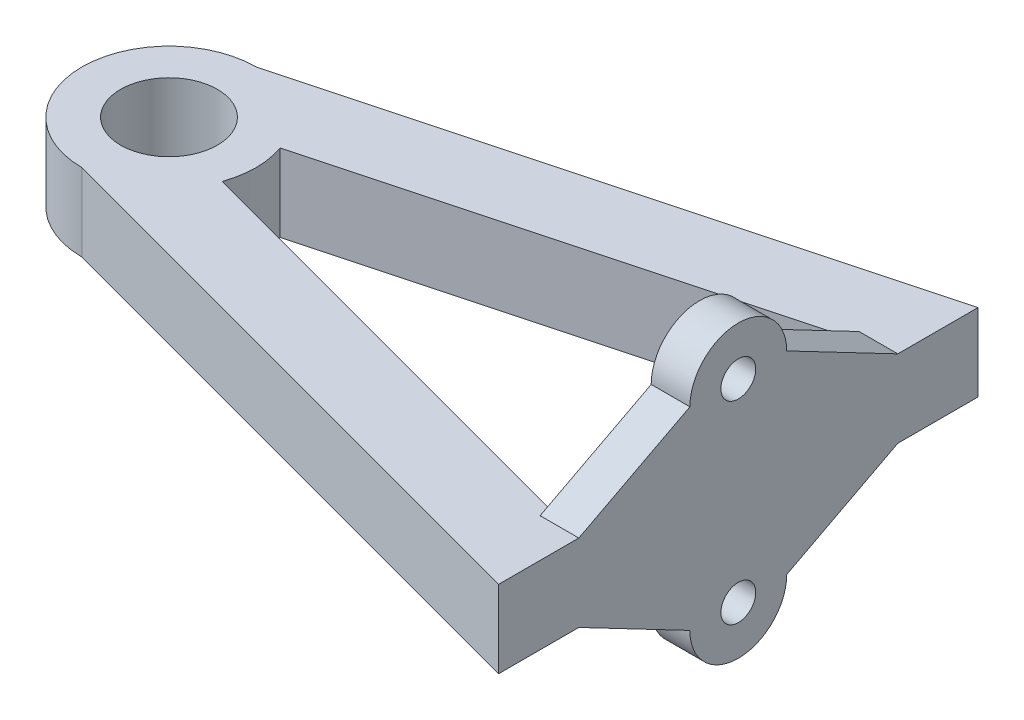
ISO-10303-21;
HEADER;
FILE_DESCRIPTION(('STEP AP214'),'2;1');
FILE_NAME('part.step','',(''),(''),'','','');
FILE_SCHEMA(('AUTOMOTIVE_DESIGN { 1 0 10303 214 1 1 1 1 }'));
ENDSEC;
DATA;
#1=APPLICATION_CONTEXT('core data for automotive mechanical design processes');
#2=APPLICATION_PROTOCOL_DEFINITION('international standard','automotive_design',2000,#1);
#3=PRODUCT_CONTEXT('',#1,'mechanical');
#4=PRODUCT('Part','Part','',(#3));
#5=PRODUCT_RELATED_PRODUCT_CATEGORY('part','',(#4));
#6=PRODUCT_DEFINITION_FORMATION('','',#4);
#7=PRODUCT_DEFINITION_CONTEXT('part definition',#1,'design');
#8=PRODUCT_DEFINITION('design','',#6,#7);
#9=PRODUCT_DEFINITION_SHAPE('','',#8);
#10=(LENGTH_UNIT() NAMED_UNIT(*) SI_UNIT(.MILLI.,.METRE.));
#11=(NAMED_UNIT(*) PLANE_ANGLE_UNIT() SI_UNIT($,.RADIAN.));
#12=(NAMED_UNIT(*) SI_UNIT($,.STERADIAN.) SOLID_ANGLE_UNIT());
#13=UNCERTAINTY_MEASURE_WITH_UNIT(LENGTH_MEASURE(1.E-05),#10,'distance_accuracy_value','');
#14=(GEOMETRIC_REPRESENTATION_CONTEXT(3) GLOBAL_UNCERTAINTY_ASSIGNED_CONTEXT((#13)) GLOBAL_UNIT_ASSIGNED_CONTEXT((#10,
#11,#12)) REPRESENTATION_CONTEXT('',''));
#15=CARTESIAN_POINT('',(0.,0.,0.));
#16=DIRECTION('',(0.,0.,1.));
#17=DIRECTION('',(1.,0.,0.));
#18=AXIS2_PLACEMENT_3D('',#15,#16,#17);
#19=CARTESIAN_POINT('',(73.5,10.,20.5915038395862));
#20=DIRECTION('',(-0.258819045102515,0.,0.96592582628907));
#21=DIRECTION('',(0.96592582628907,0.,0.258819045102515));
#22=AXIS2_PLACEMENT_3D('',#19,#20,#21);
#23=PLANE('',#22);
#24=DIRECTION('',(0.,1.,0.));
#25=VECTOR('',#24,1.);
#26=CARTESIAN_POINT('',(68.5,10.,19.2517578774306));
#27=LINE('',#26,#25);
#28=CARTESIAN_POINT('',(68.5,0.,19.2517578774306));
#29=VERTEX_POINT('',#28);
#30=CARTESIAN_POINT('',(68.5,10.,19.2517578774306));
#31=VERTEX_POINT('',#30);
#32=EDGE_CURVE('E218',#29,#31,#27,.T.);
#33=ORIENTED_EDGE('',*,*,#32,.F.);
#34=DIRECTION('',(-0.96592582628907,0.,-0.258819045102515));
#35=VECTOR('',#34,1.);
#36=CARTESIAN_POINT('',(73.5,0.,20.5915038395862));
#37=LINE('',#36,#35);
#38=CARTESIAN_POINT('',(10.6100628688813,0.,3.74019597325932));
#39=VERTEX_POINT('',#38);
#40=EDGE_CURVE('E255',#29,#39,#37,.T.);
#41=ORIENTED_EDGE('',*,*,#40,.T.);
#42=DIRECTION('',(0.,-1.,0.));
#43=VECTOR('',#42,1.);
#44=CARTESIAN_POINT('',(10.6100628688813,10.,3.74019597325932));
#45=LINE('',#44,#43);
#46=CARTESIAN_POINT('',(10.6100628688813,10.,3.74019597325932));
#47=VERTEX_POINT('',#46);
#48=EDGE_CURVE('E273',#47,#39,#45,.T.);
#49=ORIENTED_EDGE('',*,*,#48,.F.);
#50=DIRECTION('',(-0.96592582628907,0.,-0.258819045102515));
#51=VECTOR('',#50,1.);
#52=CARTESIAN_POINT('',(73.5,10.,20.5915038395862));
#53=LINE('',#52,#51);
#54=EDGE_CURVE('E237',#31,#47,#53,.T.);
#55=ORIENTED_EDGE('',*,*,#54,.F.);
#56=EDGE_LOOP('',(#33,#41,#49,#55));
#57=FACE_BOUND('',#56,.T.);
#58=ADVANCED_FACE('F33',(#57),#23,.F.);
#59=CARTESIAN_POINT('',(73.5,10.,-20.5915038395862));
#60=DIRECTION('',(-0.258819045102515,0.,-0.96592582628907));
#61=DIRECTION('',(-0.96592582628907,0.,0.258819045102515));
#62=AXIS2_PLACEMENT_3D('',#59,#60,#61);
#63=PLANE('',#62);
#64=DIRECTION('',(0.,-1.,0.));
#65=VECTOR('',#64,1.);
#66=CARTESIAN_POINT('',(68.5,10.,-19.2517578774306));
#67=LINE('',#66,#65);
#68=CARTESIAN_POINT('',(68.5,10.,-19.2517578774306));
#69=VERTEX_POINT('',#68);
#70=CARTESIAN_POINT('',(68.5,0.,-19.2517578774306));
#71=VERTEX_POINT('',#70);
#72=EDGE_CURVE('E11',#69,#71,#67,.T.);
#73=ORIENTED_EDGE('',*,*,#72,.F.);
#74=DIRECTION('',(0.96592582628907,0.,-0.258819045102515));
#75=VECTOR('',#74,1.);
#76=CARTESIAN_POINT('',(73.5,10.,-20.5915038395862));
#77=LINE('',#76,#75);
#78=CARTESIAN_POINT('',(10.6100628688813,10.,-3.74019597325932));
#79=VERTEX_POINT('',#78);
#80=EDGE_CURVE('E241',#79,#69,#77,.T.);
#81=ORIENTED_EDGE('',*,*,#80,.F.);
#82=DIRECTION('',(0.,-1.,0.));
#83=VECTOR('',#82,1.);
#84=CARTESIAN_POINT('',(10.6100628688813,10.,-3.74019597325932));
#85=LINE('',#84,#83);
#86=CARTESIAN_POINT('',(10.6100628688813,0.,-3.74019597325932));
#87=VERTEX_POINT('',#86);
#88=EDGE_CURVE('E270',#79,#87,#85,.T.);
#89=ORIENTED_EDGE('',*,*,#88,.T.);
#90=DIRECTION('',(0.96592582628907,0.,-0.258819045102515));
#91=VECTOR('',#90,1.);
#92=CARTESIAN_POINT('',(73.5,0.,-20.5915038395862));
#93=LINE('',#92,#91);
#94=EDGE_CURVE('E259',#87,#71,#93,.T.);
#95=ORIENTED_EDGE('',*,*,#94,.T.);
#96=EDGE_LOOP('',(#73,#81,#89,#95));
#97=FACE_BOUND('',#96,.T.);
#98=ADVANCED_FACE('F315',(#97),#63,.F.);
#99=CARTESIAN_POINT('',(0.,10.,0.));
#100=DIRECTION('',(0.,1.,0.));
#101=DIRECTION('',(0.,0.,1.));
#102=AXIS2_PLACEMENT_3D('',#99,#100,#101);
#103=PLANE('',#102);
#104=DIRECTION('',(1.,0.,0.));
#105=VECTOR('',#104,1.);
#106=CARTESIAN_POINT('',(68.5,10.,20.5915038395862));
#107=LINE('',#106,#105);
#108=CARTESIAN_POINT('',(68.5,10.,20.5915038395862));
#109=VERTEX_POINT('',#108);
#110=CARTESIAN_POINT('',(73.5,10.,20.5915038395862));
#111=VERTEX_POINT('',#110);
#112=EDGE_CURVE('E48',#109,#111,#107,.T.);
#113=ORIENTED_EDGE('',*,*,#112,.F.);
#114=DIRECTION('',(0.,0.,-1.));
#115=VECTOR('',#114,1.);
#116=CARTESIAN_POINT('',(68.5,10.,0.));
#117=LINE('',#116,#115);
#118=EDGE_CURVE('E219',#109,#31,#117,.T.);
#119=ORIENTED_EDGE('',*,*,#118,.T.);
#120=ORIENTED_EDGE('',*,*,#54,.T.);
#121=CARTESIAN_POINT('',(0.,10.,0.));
#122=DIRECTION('',(0.,1.,0.));
#123=DIRECTION('',(0.,0.,1.));
#124=AXIS2_PLACEMENT_3D('',#121,#122,#123);
#125=CIRCLE('',#124,11.25);
#126=EDGE_CURVE('E239',#47,#79,#125,.T.);
#127=ORIENTED_EDGE('',*,*,#126,.T.);
#128=ORIENTED_EDGE('',*,*,#80,.T.);
#129=CARTESIAN_POINT('',(68.5,10.,-20.5915038395862));
#130=VERTEX_POINT('',#129);
#131=EDGE_CURVE('E215',#69,#130,#117,.T.);
#132=ORIENTED_EDGE('',*,*,#131,.T.);
#133=DIRECTION('',(1.,0.,0.));
#134=VECTOR('',#133,1.);
#135=CARTESIAN_POINT('',(68.5,10.,-20.5915038395862));
#136=LINE('',#135,#134);
#137=CARTESIAN_POINT('',(73.5,10.,-20.5915038395862));
#138=VERTEX_POINT('',#137);
#139=EDGE_CURVE('E206',#130,#138,#136,.T.);
#140=ORIENTED_EDGE('',*,*,#139,.T.);
#141=DIRECTION('',(0.,0.,-1.));
#142=VECTOR('',#141,1.);
#143=CARTESIAN_POINT('',(73.5,10.,-30.944265643687));
#144=LINE('',#143,#142);
#145=CARTESIAN_POINT('',(73.5,10.,-30.944265643687));
#146=VERTEX_POINT('',#145);
#147=EDGE_CURVE('E244',#138,#146,#144,.T.);
#148=ORIENTED_EDGE('',*,*,#147,.T.);
#149=DIRECTION('',(-0.96592582628907,0.,0.258819045102515));
#150=VECTOR('',#149,1.);
#151=CARTESIAN_POINT('',(0.,10.,-11.25));
#152=LINE('',#151,#150);
#153=CARTESIAN_POINT('',(0.,10.,-11.25));
#154=VERTEX_POINT('',#153);
#155=EDGE_CURVE('E246',#146,#154,#152,.T.);
#156=ORIENTED_EDGE('',*,*,#155,.T.);
#157=CARTESIAN_POINT('',(0.,10.,0.));
#158=DIRECTION('',(0.,1.,0.));
#159=DIRECTION('',(0.,0.,1.));
#160=AXIS2_PLACEMENT_3D('',#157,#158,#159);
#161=CIRCLE('',#160,11.25);
#162=CARTESIAN_POINT('',(0.,10.,11.25));
#163=VERTEX_POINT('',#162);
#164=EDGE_CURVE('E229',#154,#163,#161,.T.);
#165=ORIENTED_EDGE('',*,*,#164,.T.);
#166=DIRECTION('',(0.96592582628907,0.,0.258819045102515));
#167=VECTOR('',#166,1.);
#168=CARTESIAN_POINT('',(0.,10.,11.25));
#169=LINE('',#168,#167);
#170=CARTESIAN_POINT('',(73.5,10.,30.944265643687));
#171=VERTEX_POINT('',#170);
#172=EDGE_CURVE('E232',#163,#171,#169,.T.);
#173=ORIENTED_EDGE('',*,*,#172,.T.);
#174=DIRECTION('',(0.,0.,-1.));
#175=VECTOR('',#174,1.);
#176=CARTESIAN_POINT('',(73.5,10.,30.944265643687));
#177=LINE('',#176,#175);
#178=EDGE_CURVE('E235',#171,#111,#177,.T.);
#179=ORIENTED_EDGE('',*,*,#178,.T.);
#180=EDGE_LOOP('',(#113,#119,#120,#127,#128,#132,#140,#148,#156,#165,#173,#179));
#181=FACE_BOUND('',#180,.T.);
#182=CARTESIAN_POINT('',(0.,10.,0.));
#183=DIRECTION('',(0.,1.,0.));
#184=DIRECTION('',(0.,0.,1.));
#185=AXIS2_PLACEMENT_3D('',#182,#183,#184);
#186=CIRCLE('',#185,6.25);
#187=CARTESIAN_POINT('',(0.,10.,6.25));
#188=VERTEX_POINT('',#187);
#189=EDGE_CURVE('E222',#188,#188,#186,.T.);
#190=ORIENTED_EDGE('',*,*,#189,.F.);
#191=EDGE_LOOP('',(#190));
#192=FACE_BOUND('',#191,.T.);
#193=ADVANCED_FACE('F297',(#181,#192),#103,.T.);
#194=CARTESIAN_POINT('',(0.,0.,0.));
#195=DIRECTION('',(0.,1.,0.));
#196=DIRECTION('',(0.,0.,1.));
#197=AXIS2_PLACEMENT_3D('',#194,#195,#196);
#198=PLANE('',#197);
#199=DIRECTION('',(0.,0.,-1.));
#200=VECTOR('',#199,1.);
#201=CARTESIAN_POINT('',(68.5,0.,0.));
#202=LINE('',#201,#200);
#203=CARTESIAN_POINT('',(68.5,0.,20.5915038395862));
#204=VERTEX_POINT('',#203);
#205=EDGE_CURVE('E56',#204,#29,#202,.T.);
#206=ORIENTED_EDGE('',*,*,#205,.F.);
#207=DIRECTION('',(1.,0.,0.));
#208=VECTOR('',#207,1.);
#209=CARTESIAN_POINT('',(68.5,0.,20.5915038395862));
#210=LINE('',#209,#208);
#211=CARTESIAN_POINT('',(73.5,0.,20.5915038395862));
#212=VERTEX_POINT('',#211);
#213=EDGE_CURVE('E158',#204,#212,#210,.T.);
#214=ORIENTED_EDGE('',*,*,#213,.T.);
#215=DIRECTION('',(0.,0.,-1.));
#216=VECTOR('',#215,1.);
#217=CARTESIAN_POINT('',(73.5,0.,30.944265643687));
#218=LINE('',#217,#216);
#219=CARTESIAN_POINT('',(73.5,0.,30.944265643687));
#220=VERTEX_POINT('',#219);
#221=EDGE_CURVE('E253',#220,#212,#218,.T.);
#222=ORIENTED_EDGE('',*,*,#221,.F.);
#223=DIRECTION('',(0.96592582628907,0.,0.258819045102515));
#224=VECTOR('',#223,1.);
#225=CARTESIAN_POINT('',(0.,0.,11.25));
#226=LINE('',#225,#224);
#227=CARTESIAN_POINT('',(0.,0.,11.25));
#228=VERTEX_POINT('',#227);
#229=EDGE_CURVE('E251',#228,#220,#226,.T.);
#230=ORIENTED_EDGE('',*,*,#229,.F.);
#231=CARTESIAN_POINT('',(0.,0.,0.));
#232=DIRECTION('',(0.,1.,0.));
#233=DIRECTION('',(0.,0.,1.));
#234=AXIS2_PLACEMENT_3D('',#231,#232,#233);
#235=CIRCLE('',#234,11.25);
#236=CARTESIAN_POINT('',(0.,0.,-11.25));
#237=VERTEX_POINT('',#236);
#238=EDGE_CURVE('E225',#237,#228,#235,.T.);
#239=ORIENTED_EDGE('',*,*,#238,.F.);
#240=DIRECTION('',(-0.96592582628907,0.,0.258819045102515));
#241=VECTOR('',#240,1.);
#242=CARTESIAN_POINT('',(0.,0.,-11.25));
#243=LINE('',#242,#241);
#244=CARTESIAN_POINT('',(73.5,0.,-30.944265643687));
#245=VERTEX_POINT('',#244);
#246=EDGE_CURVE('E233',#245,#237,#243,.T.);
#247=ORIENTED_EDGE('',*,*,#246,.F.);
#248=DIRECTION('',(0.,0.,-1.));
#249=VECTOR('',#248,1.);
#250=CARTESIAN_POINT('',(73.5,0.,-30.944265643687));
#251=LINE('',#250,#249);
#252=CARTESIAN_POINT('',(73.5,0.,-20.5915038395862));
#253=VERTEX_POINT('',#252);
#254=EDGE_CURVE('E262',#253,#245,#251,.T.);
#255=ORIENTED_EDGE('',*,*,#254,.F.);
#256=DIRECTION('',(1.,0.,0.));
#257=VECTOR('',#256,1.);
#258=CARTESIAN_POINT('',(68.5,0.,-20.5915038395862));
#259=LINE('',#258,#257);
#260=CARTESIAN_POINT('',(68.5,0.,-20.5915038395862));
#261=VERTEX_POINT('',#260);
#262=EDGE_CURVE('E209',#261,#253,#259,.T.);
#263=ORIENTED_EDGE('',*,*,#262,.F.);
#264=EDGE_CURVE('E201',#71,#261,#202,.T.);
#265=ORIENTED_EDGE('',*,*,#264,.F.);
#266=ORIENTED_EDGE('',*,*,#94,.F.);
#267=CARTESIAN_POINT('',(0.,0.,0.));
#268=DIRECTION('',(0.,1.,0.));
#269=DIRECTION('',(0.,0.,1.));
#270=AXIS2_PLACEMENT_3D('',#267,#268,#269);
#271=CIRCLE('',#270,11.25);
#272=EDGE_CURVE('E257',#39,#87,#271,.T.);
#273=ORIENTED_EDGE('',*,*,#272,.F.);
#274=ORIENTED_EDGE('',*,*,#40,.F.);
#275=EDGE_LOOP('',(#206,#214,#222,#230,#239,#247,#255,#263,#265,#266,#273,#274));
#276=FACE_BOUND('',#275,.T.);
#277=CARTESIAN_POINT('',(0.,0.,0.));
#278=DIRECTION('',(0.,1.,0.));
#279=DIRECTION('',(0.,0.,1.));
#280=AXIS2_PLACEMENT_3D('',#277,#278,#279);
#281=CIRCLE('',#280,6.25);
#282=CARTESIAN_POINT('',(0.,0.,6.25));
#283=VERTEX_POINT('',#282);
#284=EDGE_CURVE('E226',#283,#283,#281,.T.);
#285=ORIENTED_EDGE('',*,*,#284,.T.);
#286=EDGE_LOOP('',(#285));
#287=FACE_BOUND('',#286,.T.);
#288=ADVANCED_FACE('F288',(#276,#287),#198,.F.);
#289=CARTESIAN_POINT('',(0.,10.,0.));
#290=DIRECTION('',(0.,-1.,0.));
#291=DIRECTION('',(0.,0.,-1.));
#292=AXIS2_PLACEMENT_3D('',#289,#290,#291);
#293=CYLINDRICAL_SURFACE('',#292,11.25);
#294=ORIENTED_EDGE('',*,*,#238,.T.);
#295=DIRECTION('',(0.,-1.,0.));
#296=VECTOR('',#295,1.);
#297=CARTESIAN_POINT('',(0.,10.,11.25));
#298=LINE('',#297,#296);
#299=EDGE_CURVE('E41',#163,#228,#298,.T.);
#300=ORIENTED_EDGE('',*,*,#299,.F.);
#301=ORIENTED_EDGE('',*,*,#164,.F.);
#302=DIRECTION('',(0.,-1.,0.));
#303=VECTOR('',#302,1.);
#304=CARTESIAN_POINT('',(0.,10.,-11.25));
#305=LINE('',#304,#303);
#306=EDGE_CURVE('E248',#154,#237,#305,.T.);
#307=ORIENTED_EDGE('',*,*,#306,.T.);
#308=EDGE_LOOP('',(#294,#300,#301,#307));
#309=FACE_BOUND('',#308,.T.);
#310=ADVANCED_FACE('F35',(#309),#293,.T.);
#311=CARTESIAN_POINT('',(0.,10.,11.25));
#312=DIRECTION('',(0.258819045102515,0.,-0.96592582628907));
#313=DIRECTION('',(-0.96592582628907,0.,-0.258819045102515));
#314=AXIS2_PLACEMENT_3D('',#311,#312,#313);
#315=PLANE('',#314);
#316=ORIENTED_EDGE('',*,*,#229,.T.);
#317=DIRECTION('',(0.,-1.,0.));
#318=VECTOR('',#317,1.);
#319=CARTESIAN_POINT('',(73.5,10.,30.944265643687));
#320=LINE('',#319,#318);
#321=EDGE_CURVE('E276',#171,#220,#320,.T.);
#322=ORIENTED_EDGE('',*,*,#321,.F.);
#323=ORIENTED_EDGE('',*,*,#172,.F.);
#324=ORIENTED_EDGE('',*,*,#299,.T.);
#325=EDGE_LOOP('',(#316,#322,#323,#324));
#326=FACE_BOUND('',#325,.T.);
#327=ADVANCED_FACE('F281',(#326),#315,.F.);
#328=CARTESIAN_POINT('',(0.,10.,0.));
#329=DIRECTION('',(0.,-1.,0.));
#330=DIRECTION('',(0.,0.,-1.));
#331=AXIS2_PLACEMENT_3D('',#328,#329,#330);
#332=CYLINDRICAL_SURFACE('',#331,11.25);
#333=ORIENTED_EDGE('',*,*,#272,.T.);
#334=ORIENTED_EDGE('',*,*,#88,.F.);
#335=ORIENTED_EDGE('',*,*,#126,.F.);
#336=ORIENTED_EDGE('',*,*,#48,.T.);
#337=EDGE_LOOP('',(#333,#334,#335,#336));
#338=FACE_BOUND('',#337,.T.);
#339=ADVANCED_FACE('F311',(#338),#332,.T.);
#340=CARTESIAN_POINT('',(73.5,10.,-30.944265643687));
#341=DIRECTION('',(-1.,0.,0.));
#342=DIRECTION('',(0.,0.,1.));
#343=AXIS2_PLACEMENT_3D('',#340,#341,#342);
#344=PLANE('',#343);
#345=ORIENTED_EDGE('',*,*,#254,.T.);
#346=DIRECTION('',(0.,-1.,0.));
#347=VECTOR('',#346,1.);
#348=CARTESIAN_POINT('',(73.5,10.,-30.944265643687));
#349=LINE('',#348,#347);
#350=EDGE_CURVE('E267',#146,#245,#349,.T.);
#351=ORIENTED_EDGE('',*,*,#350,.F.);
#352=ORIENTED_EDGE('',*,*,#147,.F.);
#353=DIRECTION('',(0.,0.463414579281556,0.886141595744889));
#354=VECTOR('',#353,1.);
#355=CARTESIAN_POINT('',(73.5,17.5,-6.25));
#356=LINE('',#355,#354);
#357=CARTESIAN_POINT('',(73.5,17.5,-6.25));
#358=VERTEX_POINT('',#357);
#359=EDGE_CURVE('E195',#138,#358,#356,.T.);
#360=ORIENTED_EDGE('',*,*,#359,.T.);
#361=CARTESIAN_POINT('',(73.5,17.5,0.));
#362=DIRECTION('',(1.,0.,0.));
#363=DIRECTION('',(0.,0.,-1.));
#364=AXIS2_PLACEMENT_3D('',#361,#362,#363);
#365=CIRCLE('',#364,6.25);
#366=CARTESIAN_POINT('',(73.5,17.5,6.25));
#367=VERTEX_POINT('',#366);
#368=EDGE_CURVE('E173',#358,#367,#365,.T.);
#369=ORIENTED_EDGE('',*,*,#368,.T.);
#370=DIRECTION('',(0.,-0.463414579281556,0.886141595744889));
#371=VECTOR('',#370,1.);
#372=CARTESIAN_POINT('',(73.5,10.,20.5915038395862));
#373=LINE('',#372,#371);
#374=EDGE_CURVE('E170',#367,#111,#373,.T.);
#375=ORIENTED_EDGE('',*,*,#374,.T.);
#376=ORIENTED_EDGE('',*,*,#178,.F.);
#377=ORIENTED_EDGE('',*,*,#321,.T.);
#378=ORIENTED_EDGE('',*,*,#221,.T.);
#379=DIRECTION('',(0.,-0.463414579281556,-0.886141595744889));
#380=VECTOR('',#379,1.);
#381=CARTESIAN_POINT('',(73.5,0.,20.5915038395862));
#382=LINE('',#381,#380);
#383=CARTESIAN_POINT('',(73.5,-7.5,6.25));
#384=VERTEX_POINT('',#383);
#385=EDGE_CURVE('E189',#212,#384,#382,.T.);
#386=ORIENTED_EDGE('',*,*,#385,.T.);
#387=CARTESIAN_POINT('',(73.5,-7.5,0.));
#388=DIRECTION('',(1.,0.,0.));
#389=DIRECTION('',(0.,0.,-1.));
#390=AXIS2_PLACEMENT_3D('',#387,#388,#389);
#391=CIRCLE('',#390,6.25);
#392=CARTESIAN_POINT('',(73.5,-7.5,-6.25));
#393=VERTEX_POINT('',#392);
#394=EDGE_CURVE('E152',#384,#393,#391,.T.);
#395=ORIENTED_EDGE('',*,*,#394,.T.);
#396=DIRECTION('',(0.,0.463414579281556,-0.886141595744889));
#397=VECTOR('',#396,1.);
#398=CARTESIAN_POINT('',(73.5,-7.5,-6.25));
#399=LINE('',#398,#397);
#400=EDGE_CURVE('E193',#393,#253,#399,.T.);
#401=ORIENTED_EDGE('',*,*,#400,.T.);
#402=EDGE_LOOP('',(#345,#351,#352,#360,#369,#375,#376,#377,#378,#386,#395,#401));
#403=FACE_BOUND('',#402,.T.);
#404=CARTESIAN_POINT('',(73.5,-7.5,0.));
#405=DIRECTION('',(1.,0.,0.));
#406=DIRECTION('',(0.,0.,-1.));
#407=AXIS2_PLACEMENT_3D('',#404,#405,#406);
#408=CIRCLE('',#407,2.25);
#409=CARTESIAN_POINT('',(73.5,-7.5,-2.25));
#410=VERTEX_POINT('',#409);
#411=EDGE_CURVE('E456',#410,#410,#408,.T.);
#412=ORIENTED_EDGE('',*,*,#411,.F.);
#413=EDGE_LOOP('',(#412));
#414=FACE_BOUND('',#413,.T.);
#415=CARTESIAN_POINT('',(73.5,17.5,0.));
#416=DIRECTION('',(1.,0.,0.));
#417=DIRECTION('',(0.,0.,-1.));
#418=AXIS2_PLACEMENT_3D('',#415,#416,#417);
#419=CIRCLE('',#418,2.25);
#420=CARTESIAN_POINT('',(73.5,17.5,-2.25));
#421=VERTEX_POINT('',#420);
#422=EDGE_CURVE('E176',#421,#421,#419,.T.);
#423=ORIENTED_EDGE('',*,*,#422,.F.);
#424=EDGE_LOOP('',(#423));
#425=FACE_BOUND('',#424,.T.);
#426=ADVANCED_FACE('F293',(#403,#414,#425),#344,.F.);
#427=CARTESIAN_POINT('',(0.,10.,-11.25));
#428=DIRECTION('',(0.258819045102515,0.,0.96592582628907));
#429=DIRECTION('',(0.96592582628907,0.,-0.258819045102515));
#430=AXIS2_PLACEMENT_3D('',#427,#428,#429);
#431=PLANE('',#430);
#432=ORIENTED_EDGE('',*,*,#246,.T.);
#433=ORIENTED_EDGE('',*,*,#306,.F.);
#434=ORIENTED_EDGE('',*,*,#155,.F.);
#435=ORIENTED_EDGE('',*,*,#350,.T.);
#436=EDGE_LOOP('',(#432,#433,#434,#435));
#437=FACE_BOUND('',#436,.T.);
#438=ADVANCED_FACE('F326',(#437),#431,.F.);
#439=CARTESIAN_POINT('',(0.,10.,0.));
#440=DIRECTION('',(0.,-1.,0.));
#441=DIRECTION('',(0.,0.,-1.));
#442=AXIS2_PLACEMENT_3D('',#439,#440,#441);
#443=CYLINDRICAL_SURFACE('',#442,6.25);
#444=ORIENTED_EDGE('',*,*,#189,.T.);
#445=EDGE_LOOP('',(#444));
#446=FACE_BOUND('',#445,.T.);
#447=ORIENTED_EDGE('',*,*,#284,.F.);
#448=EDGE_LOOP('',(#447));
#449=FACE_BOUND('',#448,.T.);
#450=ADVANCED_FACE('F339',(#446,#449),#443,.F.);
#451=CARTESIAN_POINT('',(68.5,10.,20.5915038395862));
#452=DIRECTION('',(0.,0.886141595744889,0.463414579281556));
#453=DIRECTION('',(0.,-0.463414579281556,0.886141595744889));
#454=AXIS2_PLACEMENT_3D('',#451,#452,#453);
#455=PLANE('',#454);
#456=ORIENTED_EDGE('',*,*,#374,.F.);
#457=DIRECTION('',(1.,0.,0.));
#458=VECTOR('',#457,1.);
#459=CARTESIAN_POINT('',(68.5,17.5,6.25));
#460=LINE('',#459,#458);
#461=CARTESIAN_POINT('',(68.5,17.5,6.25));
#462=VERTEX_POINT('',#461);
#463=EDGE_CURVE('E202',#462,#367,#460,.T.);
#464=ORIENTED_EDGE('',*,*,#463,.F.);
#465=DIRECTION('',(0.,-0.463414579281556,0.886141595744889));
#466=VECTOR('',#465,1.);
#467=CARTESIAN_POINT('',(68.5,10.,20.5915038395862));
#468=LINE('',#467,#466);
#469=EDGE_CURVE('E186',#462,#109,#468,.T.);
#470=ORIENTED_EDGE('',*,*,#469,.T.);
#471=ORIENTED_EDGE('',*,*,#112,.T.);
#472=EDGE_LOOP('',(#456,#464,#470,#471));
#473=FACE_BOUND('',#472,.T.);
#474=ADVANCED_FACE('F300',(#473),#455,.T.);
#475=CARTESIAN_POINT('',(68.5,17.5,0.));
#476=DIRECTION('',(1.,0.,0.));
#477=DIRECTION('',(0.,0.,-1.));
#478=AXIS2_PLACEMENT_3D('',#475,#476,#477);
#479=CYLINDRICAL_SURFACE('',#478,6.25);
#480=ORIENTED_EDGE('',*,*,#368,.F.);
#481=DIRECTION('',(1.,0.,0.));
#482=VECTOR('',#481,1.);
#483=CARTESIAN_POINT('',(68.5,17.5,-6.25));
#484=LINE('',#483,#482);
#485=CARTESIAN_POINT('',(68.5,17.5,-6.25));
#486=VERTEX_POINT('',#485);
#487=EDGE_CURVE('E204',#486,#358,#484,.T.);
#488=ORIENTED_EDGE('',*,*,#487,.F.);
#489=CARTESIAN_POINT('',(68.5,17.5,0.));
#490=DIRECTION('',(1.,0.,0.));
#491=DIRECTION('',(0.,0.,-1.));
#492=AXIS2_PLACEMENT_3D('',#489,#490,#491);
#493=CIRCLE('',#492,6.25);
#494=EDGE_CURVE('E183',#486,#462,#493,.T.);
#495=ORIENTED_EDGE('',*,*,#494,.T.);
#496=ORIENTED_EDGE('',*,*,#463,.T.);
#497=EDGE_LOOP('',(#480,#488,#495,#496));
#498=FACE_BOUND('',#497,.T.);
#499=ADVANCED_FACE('F331',(#498),#479,.T.);
#500=CARTESIAN_POINT('',(68.5,17.5,-6.25));
#501=DIRECTION('',(0.,0.886141595744889,-0.463414579281556));
#502=DIRECTION('',(0.,0.463414579281556,0.886141595744889));
#503=AXIS2_PLACEMENT_3D('',#500,#501,#502);
#504=PLANE('',#503);
#505=ORIENTED_EDGE('',*,*,#359,.F.);
#506=ORIENTED_EDGE('',*,*,#139,.F.);
#507=DIRECTION('',(0.,0.463414579281556,0.886141595744889));
#508=VECTOR('',#507,1.);
#509=CARTESIAN_POINT('',(68.5,17.5,-6.25));
#510=LINE('',#509,#508);
#511=EDGE_CURVE('E180',#130,#486,#510,.T.);
#512=ORIENTED_EDGE('',*,*,#511,.T.);
#513=ORIENTED_EDGE('',*,*,#487,.T.);
#514=EDGE_LOOP('',(#505,#506,#512,#513));
#515=FACE_BOUND('',#514,.T.);
#516=ADVANCED_FACE('F329',(#515),#504,.T.);
#517=CARTESIAN_POINT('',(68.5,-7.5,-6.25));
#518=DIRECTION('',(0.,-0.886141595744889,-0.463414579281556));
#519=DIRECTION('',(0.,0.463414579281556,-0.886141595744889));
#520=AXIS2_PLACEMENT_3D('',#517,#518,#519);
#521=PLANE('',#520);
#522=ORIENTED_EDGE('',*,*,#400,.F.);
#523=DIRECTION('',(1.,0.,0.));
#524=VECTOR('',#523,1.);
#525=CARTESIAN_POINT('',(68.5,-7.5,-6.25));
#526=LINE('',#525,#524);
#527=CARTESIAN_POINT('',(68.5,-7.5,-6.25));
#528=VERTEX_POINT('',#527);
#529=EDGE_CURVE('E157',#528,#393,#526,.T.);
#530=ORIENTED_EDGE('',*,*,#529,.F.);
#531=DIRECTION('',(0.,0.463414579281556,-0.886141595744889));
#532=VECTOR('',#531,1.);
#533=CARTESIAN_POINT('',(68.5,-7.5,-6.25));
#534=LINE('',#533,#532);
#535=EDGE_CURVE('E167',#528,#261,#534,.T.);
#536=ORIENTED_EDGE('',*,*,#535,.T.);
#537=ORIENTED_EDGE('',*,*,#262,.T.);
#538=EDGE_LOOP('',(#522,#530,#536,#537));
#539=FACE_BOUND('',#538,.T.);
#540=ADVANCED_FACE('F321',(#539),#521,.T.);
#541=CARTESIAN_POINT('',(68.5,-7.5,0.));
#542=DIRECTION('',(1.,0.,0.));
#543=DIRECTION('',(0.,0.,-1.));
#544=AXIS2_PLACEMENT_3D('',#541,#542,#543);
#545=CYLINDRICAL_SURFACE('',#544,6.25);
#546=ORIENTED_EDGE('',*,*,#394,.F.);
#547=DIRECTION('',(1.,0.,0.));
#548=VECTOR('',#547,1.);
#549=CARTESIAN_POINT('',(68.5,-7.5,6.25));
#550=LINE('',#549,#548);
#551=CARTESIAN_POINT('',(68.5,-7.5,6.25));
#552=VERTEX_POINT('',#551);
#553=EDGE_CURVE('E147',#552,#384,#550,.T.);
#554=ORIENTED_EDGE('',*,*,#553,.F.);
#555=CARTESIAN_POINT('',(68.5,-7.5,0.));
#556=DIRECTION('',(1.,0.,0.));
#557=DIRECTION('',(0.,0.,-1.));
#558=AXIS2_PLACEMENT_3D('',#555,#556,#557);
#559=CIRCLE('',#558,6.25);
#560=EDGE_CURVE('E150',#552,#528,#559,.T.);
#561=ORIENTED_EDGE('',*,*,#560,.T.);
#562=ORIENTED_EDGE('',*,*,#529,.T.);
#563=EDGE_LOOP('',(#546,#554,#561,#562));
#564=FACE_BOUND('',#563,.T.);
#565=ADVANCED_FACE('F149',(#564),#545,.T.);
#566=CARTESIAN_POINT('',(68.5,0.,20.5915038395862));
#567=DIRECTION('',(0.,-0.886141595744889,0.463414579281556));
#568=DIRECTION('',(0.,-0.463414579281556,-0.886141595744889));
#569=AXIS2_PLACEMENT_3D('',#566,#567,#568);
#570=PLANE('',#569);
#571=ORIENTED_EDGE('',*,*,#385,.F.);
#572=ORIENTED_EDGE('',*,*,#213,.F.);
#573=DIRECTION('',(0.,-0.463414579281556,-0.886141595744889));
#574=VECTOR('',#573,1.);
#575=CARTESIAN_POINT('',(68.5,0.,20.5915038395862));
#576=LINE('',#575,#574);
#577=EDGE_CURVE('E165',#204,#552,#576,.T.);
#578=ORIENTED_EDGE('',*,*,#577,.T.);
#579=ORIENTED_EDGE('',*,*,#553,.T.);
#580=EDGE_LOOP('',(#571,#572,#578,#579));
#581=FACE_BOUND('',#580,.T.);
#582=ADVANCED_FACE('F169',(#581),#570,.T.);
#583=CARTESIAN_POINT('',(68.5,-7.5,0.));
#584=DIRECTION('',(1.,0.,0.));
#585=DIRECTION('',(0.,0.,-1.));
#586=AXIS2_PLACEMENT_3D('',#583,#584,#585);
#587=PLANE('',#586);
#588=ORIENTED_EDGE('',*,*,#118,.F.);
#589=ORIENTED_EDGE('',*,*,#469,.F.);
#590=ORIENTED_EDGE('',*,*,#494,.F.);
#591=ORIENTED_EDGE('',*,*,#511,.F.);
#592=ORIENTED_EDGE('',*,*,#131,.F.);
#593=ORIENTED_EDGE('',*,*,#72,.T.);
#594=ORIENTED_EDGE('',*,*,#264,.T.);
#595=ORIENTED_EDGE('',*,*,#535,.F.);
#596=ORIENTED_EDGE('',*,*,#560,.F.);
#597=ORIENTED_EDGE('',*,*,#577,.F.);
#598=ORIENTED_EDGE('',*,*,#205,.T.);
#599=ORIENTED_EDGE('',*,*,#32,.T.);
#600=EDGE_LOOP('',(#588,#589,#590,#591,#592,#593,#594,#595,#596,#597,#598,#599));
#601=FACE_BOUND('',#600,.T.);
#602=CARTESIAN_POINT('',(68.5,-7.5,0.));
#603=DIRECTION('',(1.,0.,0.));
#604=DIRECTION('',(0.,0.,-1.));
#605=AXIS2_PLACEMENT_3D('',#602,#603,#604);
#606=CIRCLE('',#605,2.25);
#607=CARTESIAN_POINT('',(68.5,-7.5,-2.25));
#608=VERTEX_POINT('',#607);
#609=EDGE_CURVE('E453',#608,#608,#606,.T.);
#610=ORIENTED_EDGE('',*,*,#609,.T.);
#611=EDGE_LOOP('',(#610));
#612=FACE_BOUND('',#611,.T.);
#613=CARTESIAN_POINT('',(68.5,17.5,0.));
#614=DIRECTION('',(1.,0.,0.));
#615=DIRECTION('',(0.,0.,-1.));
#616=AXIS2_PLACEMENT_3D('',#613,#614,#615);
#617=CIRCLE('',#616,2.25);
#618=CARTESIAN_POINT('',(68.5,17.5,-2.25));
#619=VERTEX_POINT('',#618);
#620=EDGE_CURVE('E191',#619,#619,#617,.T.);
#621=ORIENTED_EDGE('',*,*,#620,.T.);
#622=EDGE_LOOP('',(#621));
#623=FACE_BOUND('',#622,.T.);
#624=ADVANCED_FACE('F163',(#601,#612,#623),#587,.F.);
#625=CARTESIAN_POINT('',(68.5,17.5,0.));
#626=DIRECTION('',(1.,0.,0.));
#627=DIRECTION('',(0.,0.,-1.));
#628=AXIS2_PLACEMENT_3D('',#625,#626,#627);
#629=CYLINDRICAL_SURFACE('',#628,2.25);
#630=ORIENTED_EDGE('',*,*,#620,.F.);
#631=EDGE_LOOP('',(#630));
#632=FACE_BOUND('',#631,.T.);
#633=ORIENTED_EDGE('',*,*,#422,.T.);
#634=EDGE_LOOP('',(#633));
#635=FACE_BOUND('',#634,.T.);
#636=ADVANCED_FACE('F427',(#632,#635),#629,.F.);
#637=CARTESIAN_POINT('',(68.5,-7.5,0.));
#638=DIRECTION('',(1.,0.,0.));
#639=DIRECTION('',(0.,0.,-1.));
#640=AXIS2_PLACEMENT_3D('',#637,#638,#639);
#641=CYLINDRICAL_SURFACE('',#640,2.25);
#642=ORIENTED_EDGE('',*,*,#609,.F.);
#643=EDGE_LOOP('',(#642));
#644=FACE_BOUND('',#643,.T.);
#645=ORIENTED_EDGE('',*,*,#411,.T.);
#646=EDGE_LOOP('',(#645));
#647=FACE_BOUND('',#646,.T.);
#648=ADVANCED_FACE('F436',(#644,#647),#641,.F.);
#649=CLOSED_SHELL('',(#58,#98,#193,#288,#310,#327,#339,#426,#438,#450,#474,#499,#516,#540,#565,
#582,#624,#636,#648));
#650=MANIFOLD_SOLID_BREP('B2',#649);
#651=ADVANCED_BREP_SHAPE_REPRESENTATION('',(#18,#650),#14);
#652=SHAPE_DEFINITION_REPRESENTATION(#9,#651);
ENDSEC;
END-ISO-10303-21;
